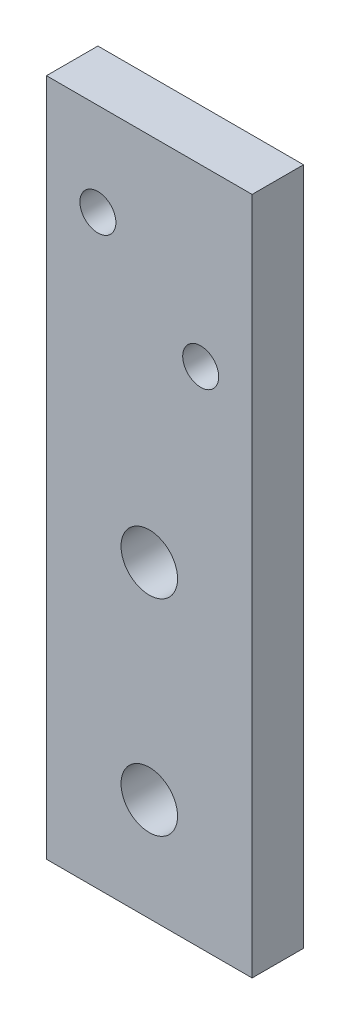
ISO-10303-21;
HEADER;
FILE_DESCRIPTION(('STEP AP214'),'2;1');
FILE_NAME('part.step','',(''),(''),'','','');
FILE_SCHEMA(('AUTOMOTIVE_DESIGN { 1 0 10303 214 1 1 1 1 }'));
ENDSEC;
DATA;
#1=APPLICATION_CONTEXT('core data for automotive mechanical design processes');
#2=APPLICATION_PROTOCOL_DEFINITION('international standard','automotive_design',2000,#1);
#3=PRODUCT_CONTEXT('',#1,'mechanical');
#4=PRODUCT('Part','Part','',(#3));
#5=PRODUCT_RELATED_PRODUCT_CATEGORY('part','',(#4));
#6=PRODUCT_DEFINITION_FORMATION('','',#4);
#7=PRODUCT_DEFINITION_CONTEXT('part definition',#1,'design');
#8=PRODUCT_DEFINITION('design','',#6,#7);
#9=PRODUCT_DEFINITION_SHAPE('','',#8);
#10=(LENGTH_UNIT() NAMED_UNIT(*) SI_UNIT(.MILLI.,.METRE.));
#11=(NAMED_UNIT(*) PLANE_ANGLE_UNIT() SI_UNIT($,.RADIAN.));
#12=(NAMED_UNIT(*) SI_UNIT($,.STERADIAN.) SOLID_ANGLE_UNIT());
#13=UNCERTAINTY_MEASURE_WITH_UNIT(LENGTH_MEASURE(1.E-05),#10,'distance_accuracy_value','');
#14=(GEOMETRIC_REPRESENTATION_CONTEXT(3) GLOBAL_UNCERTAINTY_ASSIGNED_CONTEXT((#13)) GLOBAL_UNIT_ASSIGNED_CONTEXT((#10,
#11,#12)) REPRESENTATION_CONTEXT('',''));
#15=CARTESIAN_POINT('',(0.,0.,0.));
#16=DIRECTION('',(0.,0.,1.));
#17=DIRECTION('',(1.,0.,0.));
#18=AXIS2_PLACEMENT_3D('',#15,#16,#17);
#19=CARTESIAN_POINT('',(0.,0.,5.));
#20=DIRECTION('',(0.,0.,1.));
#21=DIRECTION('',(1.,0.,0.));
#22=AXIS2_PLACEMENT_3D('',#19,#20,#21);
#23=PLANE('',#22);
#24=CARTESIAN_POINT('',(-11.174697729411,15.8913043478261,5.));
#25=DIRECTION('',(0.,0.,1.));
#26=DIRECTION('',(1.,0.,0.));
#27=AXIS2_PLACEMENT_3D('',#24,#25,#26);
#28=CIRCLE('',#27,1.75);
#29=CARTESIAN_POINT('',(-9.42469772941095,15.8913043478261,5.));
#30=VERTEX_POINT('',#29);
#31=EDGE_CURVE('E122',#30,#30,#28,.T.);
#32=ORIENTED_EDGE('',*,*,#31,.F.);
#33=EDGE_LOOP('',(#32));
#34=FACE_BOUND('',#33,.T.);
#35=CARTESIAN_POINT('',(-6.17469772941095,-31.1086956521739,5.));
#36=DIRECTION('',(0.,0.,1.));
#37=DIRECTION('',(1.,0.,0.));
#38=AXIS2_PLACEMENT_3D('',#35,#36,#37);
#39=CIRCLE('',#38,2.75);
#40=CARTESIAN_POINT('',(-3.42469772941095,-31.1086956521739,5.));
#41=VERTEX_POINT('',#40);
#42=EDGE_CURVE('E101',#41,#41,#39,.T.);
#43=ORIENTED_EDGE('',*,*,#42,.F.);
#44=EDGE_LOOP('',(#43));
#45=FACE_BOUND('',#44,.T.);
#46=DIRECTION('',(0.,-1.,0.));
#47=VECTOR('',#46,1.);
#48=CARTESIAN_POINT('',(-16.174697729411,24.8913043478261,5.));
#49=LINE('',#48,#47);
#50=CARTESIAN_POINT('',(-16.174697729411,24.8913043478261,5.));
#51=VERTEX_POINT('',#50);
#52=CARTESIAN_POINT('',(-16.1746977294109,-41.1086956521739,5.));
#53=VERTEX_POINT('',#52);
#54=EDGE_CURVE('E86',#51,#53,#49,.T.);
#55=ORIENTED_EDGE('',*,*,#54,.T.);
#56=DIRECTION('',(1.,0.,0.));
#57=VECTOR('',#56,1.);
#58=CARTESIAN_POINT('',(-16.1746977294109,-41.1086956521739,5.));
#59=LINE('',#58,#57);
#60=CARTESIAN_POINT('',(3.82530227058904,-41.1086956521739,5.));
#61=VERTEX_POINT('',#60);
#62=EDGE_CURVE('E81',#53,#61,#59,.T.);
#63=ORIENTED_EDGE('',*,*,#62,.T.);
#64=DIRECTION('',(0.,1.,0.));
#65=VECTOR('',#64,1.);
#66=CARTESIAN_POINT('',(3.82530227058905,24.8913043478261,5.));
#67=LINE('',#66,#65);
#68=CARTESIAN_POINT('',(3.82530227058905,24.8913043478261,5.));
#69=VERTEX_POINT('',#68);
#70=EDGE_CURVE('E84',#61,#69,#67,.T.);
#71=ORIENTED_EDGE('',*,*,#70,.T.);
#72=DIRECTION('',(-1.,0.,0.));
#73=VECTOR('',#72,1.);
#74=CARTESIAN_POINT('',(-16.174697729411,24.8913043478261,5.));
#75=LINE('',#74,#73);
#76=EDGE_CURVE('E51',#69,#51,#75,.T.);
#77=ORIENTED_EDGE('',*,*,#76,.T.);
#78=EDGE_LOOP('',(#55,#63,#71,#77));
#79=FACE_BOUND('',#78,.T.);
#80=CARTESIAN_POINT('',(-6.17469772941095,-11.1086956521739,5.));
#81=DIRECTION('',(0.,0.,1.));
#82=DIRECTION('',(1.,0.,0.));
#83=AXIS2_PLACEMENT_3D('',#80,#81,#82);
#84=CIRCLE('',#83,2.75);
#85=CARTESIAN_POINT('',(-3.42469772941095,-11.1086956521739,5.));
#86=VERTEX_POINT('',#85);
#87=EDGE_CURVE('E116',#86,#86,#84,.T.);
#88=ORIENTED_EDGE('',*,*,#87,.F.);
#89=EDGE_LOOP('',(#88));
#90=FACE_BOUND('',#89,.T.);
#91=CARTESIAN_POINT('',(-1.17469772941095,7.89130434782613,5.));
#92=DIRECTION('',(0.,0.,1.));
#93=DIRECTION('',(1.,0.,0.));
#94=AXIS2_PLACEMENT_3D('',#91,#92,#93);
#95=CIRCLE('',#94,1.75);
#96=CARTESIAN_POINT('',(0.575302270589051,7.89130434782613,5.));
#97=VERTEX_POINT('',#96);
#98=EDGE_CURVE('E128',#97,#97,#95,.T.);
#99=ORIENTED_EDGE('',*,*,#98,.F.);
#100=EDGE_LOOP('',(#99));
#101=FACE_BOUND('',#100,.T.);
#102=ADVANCED_FACE('F34',(#34,#45,#79,#90,#101),#23,.T.);
#103=CARTESIAN_POINT('',(0.,0.,0.));
#104=DIRECTION('',(0.,0.,1.));
#105=DIRECTION('',(1.,0.,0.));
#106=AXIS2_PLACEMENT_3D('',#103,#104,#105);
#107=PLANE('',#106);
#108=DIRECTION('',(0.,-1.,0.));
#109=VECTOR('',#108,1.);
#110=CARTESIAN_POINT('',(-16.174697729411,24.8913043478261,0.));
#111=LINE('',#110,#109);
#112=CARTESIAN_POINT('',(-16.174697729411,24.8913043478261,0.));
#113=VERTEX_POINT('',#112);
#114=CARTESIAN_POINT('',(-16.1746977294109,-41.1086956521739,0.));
#115=VERTEX_POINT('',#114);
#116=EDGE_CURVE('E98',#113,#115,#111,.T.);
#117=ORIENTED_EDGE('',*,*,#116,.F.);
#118=DIRECTION('',(-1.,0.,0.));
#119=VECTOR('',#118,1.);
#120=CARTESIAN_POINT('',(-16.174697729411,24.8913043478261,0.));
#121=LINE('',#120,#119);
#122=CARTESIAN_POINT('',(3.82530227058905,24.8913043478261,0.));
#123=VERTEX_POINT('',#122);
#124=EDGE_CURVE('E74',#123,#113,#121,.T.);
#125=ORIENTED_EDGE('',*,*,#124,.F.);
#126=DIRECTION('',(0.,1.,0.));
#127=VECTOR('',#126,1.);
#128=CARTESIAN_POINT('',(3.82530227058905,24.8913043478261,0.));
#129=LINE('',#128,#127);
#130=CARTESIAN_POINT('',(3.82530227058904,-41.1086956521739,0.));
#131=VERTEX_POINT('',#130);
#132=EDGE_CURVE('E68',#131,#123,#129,.T.);
#133=ORIENTED_EDGE('',*,*,#132,.F.);
#134=DIRECTION('',(1.,0.,0.));
#135=VECTOR('',#134,1.);
#136=CARTESIAN_POINT('',(-16.1746977294109,-41.1086956521739,0.));
#137=LINE('',#136,#135);
#138=EDGE_CURVE('E90',#115,#131,#137,.T.);
#139=ORIENTED_EDGE('',*,*,#138,.F.);
#140=EDGE_LOOP('',(#117,#125,#133,#139));
#141=FACE_BOUND('',#140,.T.);
#142=CARTESIAN_POINT('',(-6.17469772941095,-31.1086956521739,0.));
#143=DIRECTION('',(0.,0.,1.));
#144=DIRECTION('',(1.,0.,0.));
#145=AXIS2_PLACEMENT_3D('',#142,#143,#144);
#146=CIRCLE('',#145,2.75);
#147=CARTESIAN_POINT('',(-3.42469772941095,-31.1086956521739,0.));
#148=VERTEX_POINT('',#147);
#149=EDGE_CURVE('E113',#148,#148,#146,.T.);
#150=ORIENTED_EDGE('',*,*,#149,.T.);
#151=EDGE_LOOP('',(#150));
#152=FACE_BOUND('',#151,.T.);
#153=CARTESIAN_POINT('',(-6.17469772941095,-11.1086956521739,0.));
#154=DIRECTION('',(0.,0.,1.));
#155=DIRECTION('',(1.,0.,0.));
#156=AXIS2_PLACEMENT_3D('',#153,#154,#155);
#157=CIRCLE('',#156,2.75);
#158=CARTESIAN_POINT('',(-3.42469772941095,-11.1086956521739,0.));
#159=VERTEX_POINT('',#158);
#160=EDGE_CURVE('E119',#159,#159,#157,.T.);
#161=ORIENTED_EDGE('',*,*,#160,.T.);
#162=EDGE_LOOP('',(#161));
#163=FACE_BOUND('',#162,.T.);
#164=CARTESIAN_POINT('',(-11.174697729411,15.8913043478261,0.));
#165=DIRECTION('',(0.,0.,1.));
#166=DIRECTION('',(1.,0.,0.));
#167=AXIS2_PLACEMENT_3D('',#164,#165,#166);
#168=CIRCLE('',#167,1.75);
#169=CARTESIAN_POINT('',(-9.42469772941095,15.8913043478261,0.));
#170=VERTEX_POINT('',#169);
#171=EDGE_CURVE('E125',#170,#170,#168,.T.);
#172=ORIENTED_EDGE('',*,*,#171,.T.);
#173=EDGE_LOOP('',(#172));
#174=FACE_BOUND('',#173,.T.);
#175=CARTESIAN_POINT('',(-1.17469772941095,7.89130434782613,0.));
#176=DIRECTION('',(0.,0.,1.));
#177=DIRECTION('',(1.,0.,0.));
#178=AXIS2_PLACEMENT_3D('',#175,#176,#177);
#179=CIRCLE('',#178,1.75);
#180=CARTESIAN_POINT('',(0.575302270589051,7.89130434782613,0.));
#181=VERTEX_POINT('',#180);
#182=EDGE_CURVE('E131',#181,#181,#179,.T.);
#183=ORIENTED_EDGE('',*,*,#182,.T.);
#184=EDGE_LOOP('',(#183));
#185=FACE_BOUND('',#184,.T.);
#186=ADVANCED_FACE('F109',(#141,#152,#163,#174,#185),#107,.F.);
#187=CARTESIAN_POINT('',(-16.174697729411,24.8913043478261,5.));
#188=DIRECTION('',(1.,0.,0.));
#189=DIRECTION('',(0.,1.,0.));
#190=AXIS2_PLACEMENT_3D('',#187,#188,#189);
#191=PLANE('',#190);
#192=ORIENTED_EDGE('',*,*,#116,.T.);
#193=DIRECTION('',(0.,0.,-1.));
#194=VECTOR('',#193,1.);
#195=CARTESIAN_POINT('',(-16.1746977294109,-41.1086956521739,5.));
#196=LINE('',#195,#194);
#197=EDGE_CURVE('E11',#53,#115,#196,.T.);
#198=ORIENTED_EDGE('',*,*,#197,.F.);
#199=ORIENTED_EDGE('',*,*,#54,.F.);
#200=DIRECTION('',(0.,0.,-1.));
#201=VECTOR('',#200,1.);
#202=CARTESIAN_POINT('',(-16.174697729411,24.8913043478261,5.));
#203=LINE('',#202,#201);
#204=EDGE_CURVE('E94',#51,#113,#203,.T.);
#205=ORIENTED_EDGE('',*,*,#204,.T.);
#206=EDGE_LOOP('',(#192,#198,#199,#205));
#207=FACE_BOUND('',#206,.T.);
#208=ADVANCED_FACE('F36',(#207),#191,.F.);
#209=CARTESIAN_POINT('',(-16.1746977294109,-41.1086956521739,5.));
#210=DIRECTION('',(0.,1.,0.));
#211=DIRECTION('',(0.,0.,1.));
#212=AXIS2_PLACEMENT_3D('',#209,#210,#211);
#213=PLANE('',#212);
#214=ORIENTED_EDGE('',*,*,#138,.T.);
#215=DIRECTION('',(0.,0.,-1.));
#216=VECTOR('',#215,1.);
#217=CARTESIAN_POINT('',(3.82530227058904,-41.1086956521739,5.));
#218=LINE('',#217,#216);
#219=EDGE_CURVE('E43',#61,#131,#218,.T.);
#220=ORIENTED_EDGE('',*,*,#219,.F.);
#221=ORIENTED_EDGE('',*,*,#62,.F.);
#222=ORIENTED_EDGE('',*,*,#197,.T.);
#223=EDGE_LOOP('',(#214,#220,#221,#222));
#224=FACE_BOUND('',#223,.T.);
#225=ADVANCED_FACE('F89',(#224),#213,.F.);
#226=CARTESIAN_POINT('',(3.82530227058905,24.8913043478261,5.));
#227=DIRECTION('',(-1.,0.,0.));
#228=DIRECTION('',(0.,-1.,0.));
#229=AXIS2_PLACEMENT_3D('',#226,#227,#228);
#230=PLANE('',#229);
#231=ORIENTED_EDGE('',*,*,#132,.T.);
#232=DIRECTION('',(0.,0.,-1.));
#233=VECTOR('',#232,1.);
#234=CARTESIAN_POINT('',(3.82530227058905,24.8913043478261,5.));
#235=LINE('',#234,#233);
#236=EDGE_CURVE('E91',#69,#123,#235,.T.);
#237=ORIENTED_EDGE('',*,*,#236,.F.);
#238=ORIENTED_EDGE('',*,*,#70,.F.);
#239=ORIENTED_EDGE('',*,*,#219,.T.);
#240=EDGE_LOOP('',(#231,#237,#238,#239));
#241=FACE_BOUND('',#240,.T.);
#242=ADVANCED_FACE('F92',(#241),#230,.F.);
#243=CARTESIAN_POINT('',(-16.174697729411,24.8913043478261,5.));
#244=DIRECTION('',(0.,-1.,0.));
#245=DIRECTION('',(0.,0.,-1.));
#246=AXIS2_PLACEMENT_3D('',#243,#244,#245);
#247=PLANE('',#246);
#248=ORIENTED_EDGE('',*,*,#124,.T.);
#249=ORIENTED_EDGE('',*,*,#204,.F.);
#250=ORIENTED_EDGE('',*,*,#76,.F.);
#251=ORIENTED_EDGE('',*,*,#236,.T.);
#252=EDGE_LOOP('',(#248,#249,#250,#251));
#253=FACE_BOUND('',#252,.T.);
#254=ADVANCED_FACE('F106',(#253),#247,.F.);
#255=CARTESIAN_POINT('',(-6.17469772941095,-31.1086956521739,5.));
#256=DIRECTION('',(0.,0.,-1.));
#257=DIRECTION('',(-1.,0.,0.));
#258=AXIS2_PLACEMENT_3D('',#255,#256,#257);
#259=CYLINDRICAL_SURFACE('',#258,2.75);
#260=ORIENTED_EDGE('',*,*,#42,.T.);
#261=EDGE_LOOP('',(#260));
#262=FACE_BOUND('',#261,.T.);
#263=ORIENTED_EDGE('',*,*,#149,.F.);
#264=EDGE_LOOP('',(#263));
#265=FACE_BOUND('',#264,.T.);
#266=ADVANCED_FACE('F150',(#262,#265),#259,.F.);
#267=CARTESIAN_POINT('',(-6.17469772941095,-11.1086956521739,5.));
#268=DIRECTION('',(0.,0.,-1.));
#269=DIRECTION('',(-1.,0.,0.));
#270=AXIS2_PLACEMENT_3D('',#267,#268,#269);
#271=CYLINDRICAL_SURFACE('',#270,2.75);
#272=ORIENTED_EDGE('',*,*,#87,.T.);
#273=EDGE_LOOP('',(#272));
#274=FACE_BOUND('',#273,.T.);
#275=ORIENTED_EDGE('',*,*,#160,.F.);
#276=EDGE_LOOP('',(#275));
#277=FACE_BOUND('',#276,.T.);
#278=ADVANCED_FACE('F196',(#274,#277),#271,.F.);
#279=CARTESIAN_POINT('',(-11.174697729411,15.8913043478261,5.));
#280=DIRECTION('',(0.,0.,-1.));
#281=DIRECTION('',(-1.,0.,0.));
#282=AXIS2_PLACEMENT_3D('',#279,#280,#281);
#283=CYLINDRICAL_SURFACE('',#282,1.75);
#284=ORIENTED_EDGE('',*,*,#31,.T.);
#285=EDGE_LOOP('',(#284));
#286=FACE_BOUND('',#285,.T.);
#287=ORIENTED_EDGE('',*,*,#171,.F.);
#288=EDGE_LOOP('',(#287));
#289=FACE_BOUND('',#288,.T.);
#290=ADVANCED_FACE('F204',(#286,#289),#283,.F.);
#291=CARTESIAN_POINT('',(-1.17469772941095,7.89130434782613,5.));
#292=DIRECTION('',(0.,0.,-1.));
#293=DIRECTION('',(-1.,0.,0.));
#294=AXIS2_PLACEMENT_3D('',#291,#292,#293);
#295=CYLINDRICAL_SURFACE('',#294,1.75);
#296=ORIENTED_EDGE('',*,*,#98,.T.);
#297=EDGE_LOOP('',(#296));
#298=FACE_BOUND('',#297,.T.);
#299=ORIENTED_EDGE('',*,*,#182,.F.);
#300=EDGE_LOOP('',(#299));
#301=FACE_BOUND('',#300,.T.);
#302=ADVANCED_FACE('F137',(#298,#301),#295,.F.);
#303=CLOSED_SHELL('',(#102,#186,#208,#225,#242,#254,#266,#278,#290,#302));
#304=MANIFOLD_SOLID_BREP('B2',#303);
#305=ADVANCED_BREP_SHAPE_REPRESENTATION('',(#18,#304),#14);
#306=SHAPE_DEFINITION_REPRESENTATION(#9,#305);
ENDSEC;
END-ISO-10303-21;
